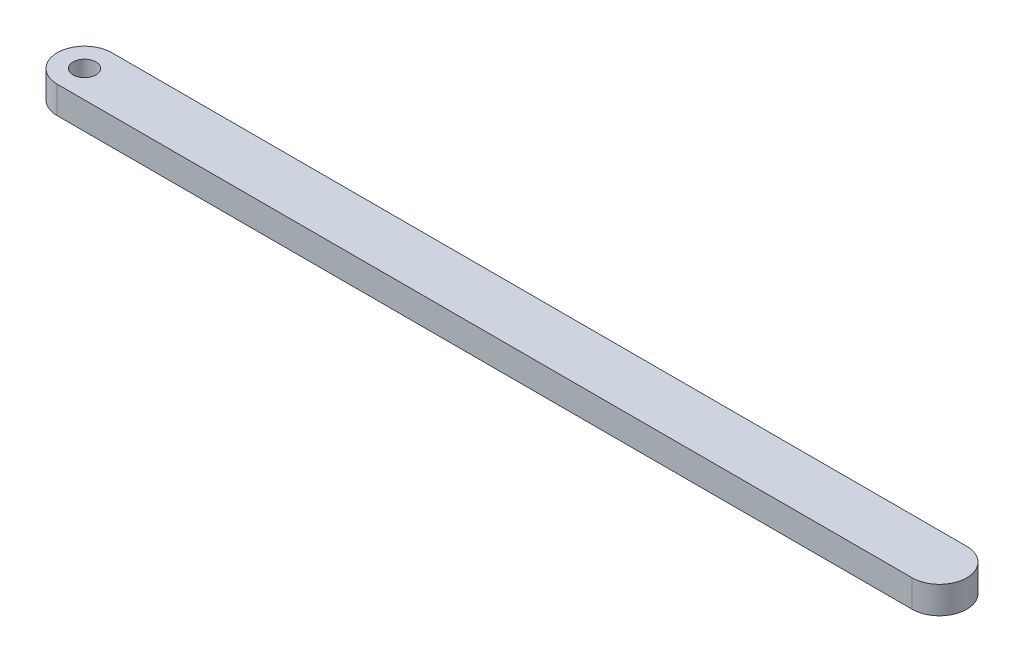
ISO-10303-21;
HEADER;
FILE_DESCRIPTION(('STEP AP214'),'2;1');
FILE_NAME('part.step','',(''),(''),'','','');
FILE_SCHEMA(('AUTOMOTIVE_DESIGN { 1 0 10303 214 1 1 1 1 }'));
ENDSEC;
DATA;
#1=APPLICATION_CONTEXT('core data for automotive mechanical design processes');
#2=APPLICATION_PROTOCOL_DEFINITION('international standard','automotive_design',2000,#1);
#3=PRODUCT_CONTEXT('',#1,'mechanical');
#4=PRODUCT('Part','Part','',(#3));
#5=PRODUCT_RELATED_PRODUCT_CATEGORY('part','',(#4));
#6=PRODUCT_DEFINITION_FORMATION('','',#4);
#7=PRODUCT_DEFINITION_CONTEXT('part definition',#1,'design');
#8=PRODUCT_DEFINITION('design','',#6,#7);
#9=PRODUCT_DEFINITION_SHAPE('','',#8);
#10=(LENGTH_UNIT() NAMED_UNIT(*) SI_UNIT(.MILLI.,.METRE.));
#11=(NAMED_UNIT(*) PLANE_ANGLE_UNIT() SI_UNIT($,.RADIAN.));
#12=(NAMED_UNIT(*) SI_UNIT($,.STERADIAN.) SOLID_ANGLE_UNIT());
#13=UNCERTAINTY_MEASURE_WITH_UNIT(LENGTH_MEASURE(1.E-05),#10,'distance_accuracy_value','');
#14=(GEOMETRIC_REPRESENTATION_CONTEXT(3) GLOBAL_UNCERTAINTY_ASSIGNED_CONTEXT((#13)) GLOBAL_UNIT_ASSIGNED_CONTEXT((#10,
#11,#12)) REPRESENTATION_CONTEXT('',''));
#15=CARTESIAN_POINT('',(0.,0.,0.));
#16=DIRECTION('',(0.,0.,1.));
#17=DIRECTION('',(1.,0.,0.));
#18=AXIS2_PLACEMENT_3D('',#15,#16,#17);
#19=CARTESIAN_POINT('',(0.,6.,0.));
#20=DIRECTION('',(0.,1.,0.));
#21=DIRECTION('',(0.,0.,1.));
#22=AXIS2_PLACEMENT_3D('',#19,#20,#21);
#23=PLANE('',#22);
#24=CARTESIAN_POINT('',(0.,6.,0.));
#25=DIRECTION('',(0.,1.,0.));
#26=DIRECTION('',(0.,0.,1.));
#27=AXIS2_PLACEMENT_3D('',#24,#25,#26);
#28=CIRCLE('',#27,6.);
#29=CARTESIAN_POINT('',(0.,6.,-6.));
#30=VERTEX_POINT('',#29);
#31=CARTESIAN_POINT('',(0.,6.,6.));
#32=VERTEX_POINT('',#31);
#33=EDGE_CURVE('E89',#30,#32,#28,.T.);
#34=ORIENTED_EDGE('',*,*,#33,.T.);
#35=DIRECTION('',(1.,0.,0.));
#36=VECTOR('',#35,1.);
#37=CARTESIAN_POINT('',(0.,6.,6.));
#38=LINE('',#37,#36);
#39=CARTESIAN_POINT('',(188.,6.,6.));
#40=VERTEX_POINT('',#39);
#41=EDGE_CURVE('E84',#32,#40,#38,.T.);
#42=ORIENTED_EDGE('',*,*,#41,.T.);
#43=CARTESIAN_POINT('',(188.,6.,0.));
#44=DIRECTION('',(0.,1.,0.));
#45=DIRECTION('',(0.,0.,1.));
#46=AXIS2_PLACEMENT_3D('',#43,#44,#45);
#47=CIRCLE('',#46,6.);
#48=CARTESIAN_POINT('',(188.,6.,-6.));
#49=VERTEX_POINT('',#48);
#50=EDGE_CURVE('E87',#40,#49,#47,.T.);
#51=ORIENTED_EDGE('',*,*,#50,.T.);
#52=DIRECTION('',(-1.,0.,0.));
#53=VECTOR('',#52,1.);
#54=CARTESIAN_POINT('',(0.,6.,-6.));
#55=LINE('',#54,#53);
#56=EDGE_CURVE('E54',#49,#30,#55,.T.);
#57=ORIENTED_EDGE('',*,*,#56,.T.);
#58=EDGE_LOOP('',(#34,#42,#51,#57));
#59=FACE_BOUND('',#58,.T.);
#60=CARTESIAN_POINT('',(0.,6.,0.));
#61=DIRECTION('',(0.,1.,0.));
#62=DIRECTION('',(0.,0.,1.));
#63=AXIS2_PLACEMENT_3D('',#60,#61,#62);
#64=CIRCLE('',#63,2.5);
#65=CARTESIAN_POINT('',(0.,6.,2.5));
#66=VERTEX_POINT('',#65);
#67=EDGE_CURVE('E104',#66,#66,#64,.T.);
#68=ORIENTED_EDGE('',*,*,#67,.F.);
#69=EDGE_LOOP('',(#68));
#70=FACE_BOUND('',#69,.T.);
#71=ADVANCED_FACE('F37',(#59,#70),#23,.T.);
#72=CARTESIAN_POINT('',(0.,0.,0.));
#73=DIRECTION('',(0.,1.,0.));
#74=DIRECTION('',(0.,0.,1.));
#75=AXIS2_PLACEMENT_3D('',#72,#73,#74);
#76=PLANE('',#75);
#77=CARTESIAN_POINT('',(0.,0.,0.));
#78=DIRECTION('',(0.,1.,0.));
#79=DIRECTION('',(0.,0.,1.));
#80=AXIS2_PLACEMENT_3D('',#77,#78,#79);
#81=CIRCLE('',#80,6.);
#82=CARTESIAN_POINT('',(0.,0.,-6.));
#83=VERTEX_POINT('',#82);
#84=CARTESIAN_POINT('',(0.,0.,6.));
#85=VERTEX_POINT('',#84);
#86=EDGE_CURVE('E101',#83,#85,#81,.T.);
#87=ORIENTED_EDGE('',*,*,#86,.F.);
#88=DIRECTION('',(-1.,0.,0.));
#89=VECTOR('',#88,1.);
#90=CARTESIAN_POINT('',(0.,0.,-6.));
#91=LINE('',#90,#89);
#92=CARTESIAN_POINT('',(188.,0.,-6.));
#93=VERTEX_POINT('',#92);
#94=EDGE_CURVE('E77',#93,#83,#91,.T.);
#95=ORIENTED_EDGE('',*,*,#94,.F.);
#96=CARTESIAN_POINT('',(188.,0.,0.));
#97=DIRECTION('',(0.,1.,0.));
#98=DIRECTION('',(0.,0.,1.));
#99=AXIS2_PLACEMENT_3D('',#96,#97,#98);
#100=CIRCLE('',#99,6.);
#101=CARTESIAN_POINT('',(188.,0.,6.));
#102=VERTEX_POINT('',#101);
#103=EDGE_CURVE('E71',#102,#93,#100,.T.);
#104=ORIENTED_EDGE('',*,*,#103,.F.);
#105=DIRECTION('',(1.,0.,0.));
#106=VECTOR('',#105,1.);
#107=CARTESIAN_POINT('',(0.,0.,6.));
#108=LINE('',#107,#106);
#109=EDGE_CURVE('E93',#85,#102,#108,.T.);
#110=ORIENTED_EDGE('',*,*,#109,.F.);
#111=EDGE_LOOP('',(#87,#95,#104,#110));
#112=FACE_BOUND('',#111,.T.);
#113=CARTESIAN_POINT('',(0.,0.,0.));
#114=DIRECTION('',(0.,1.,0.));
#115=DIRECTION('',(0.,0.,1.));
#116=AXIS2_PLACEMENT_3D('',#113,#114,#115);
#117=CIRCLE('',#116,2.5);
#118=CARTESIAN_POINT('',(0.,0.,2.5));
#119=VERTEX_POINT('',#118);
#120=EDGE_CURVE('E116',#119,#119,#117,.T.);
#121=ORIENTED_EDGE('',*,*,#120,.T.);
#122=EDGE_LOOP('',(#121));
#123=FACE_BOUND('',#122,.T.);
#124=ADVANCED_FACE('F112',(#112,#123),#76,.F.);
#125=CARTESIAN_POINT('',(0.,6.,0.));
#126=DIRECTION('',(0.,-1.,0.));
#127=DIRECTION('',(0.,0.,-1.));
#128=AXIS2_PLACEMENT_3D('',#125,#126,#127);
#129=CYLINDRICAL_SURFACE('',#128,6.);
#130=ORIENTED_EDGE('',*,*,#86,.T.);
#131=DIRECTION('',(0.,-1.,0.));
#132=VECTOR('',#131,1.);
#133=CARTESIAN_POINT('',(0.,6.,6.));
#134=LINE('',#133,#132);
#135=EDGE_CURVE('E11',#32,#85,#134,.T.);
#136=ORIENTED_EDGE('',*,*,#135,.F.);
#137=ORIENTED_EDGE('',*,*,#33,.F.);
#138=DIRECTION('',(0.,-1.,0.));
#139=VECTOR('',#138,1.);
#140=CARTESIAN_POINT('',(0.,6.,-6.));
#141=LINE('',#140,#139);
#142=EDGE_CURVE('E97',#30,#83,#141,.T.);
#143=ORIENTED_EDGE('',*,*,#142,.T.);
#144=EDGE_LOOP('',(#130,#136,#137,#143));
#145=FACE_BOUND('',#144,.T.);
#146=ADVANCED_FACE('F39',(#145),#129,.T.);
#147=CARTESIAN_POINT('',(0.,6.,6.));
#148=DIRECTION('',(0.,0.,-1.));
#149=DIRECTION('',(-1.,0.,0.));
#150=AXIS2_PLACEMENT_3D('',#147,#148,#149);
#151=PLANE('',#150);
#152=ORIENTED_EDGE('',*,*,#109,.T.);
#153=DIRECTION('',(0.,-1.,0.));
#154=VECTOR('',#153,1.);
#155=CARTESIAN_POINT('',(188.,6.,6.));
#156=LINE('',#155,#154);
#157=EDGE_CURVE('E46',#40,#102,#156,.T.);
#158=ORIENTED_EDGE('',*,*,#157,.F.);
#159=ORIENTED_EDGE('',*,*,#41,.F.);
#160=ORIENTED_EDGE('',*,*,#135,.T.);
#161=EDGE_LOOP('',(#152,#158,#159,#160));
#162=FACE_BOUND('',#161,.T.);
#163=ADVANCED_FACE('F92',(#162),#151,.F.);
#164=CARTESIAN_POINT('',(188.,6.,0.));
#165=DIRECTION('',(0.,-1.,0.));
#166=DIRECTION('',(0.,0.,-1.));
#167=AXIS2_PLACEMENT_3D('',#164,#165,#166);
#168=CYLINDRICAL_SURFACE('',#167,6.);
#169=ORIENTED_EDGE('',*,*,#103,.T.);
#170=DIRECTION('',(0.,-1.,0.));
#171=VECTOR('',#170,1.);
#172=CARTESIAN_POINT('',(188.,6.,-6.));
#173=LINE('',#172,#171);
#174=EDGE_CURVE('E94',#49,#93,#173,.T.);
#175=ORIENTED_EDGE('',*,*,#174,.F.);
#176=ORIENTED_EDGE('',*,*,#50,.F.);
#177=ORIENTED_EDGE('',*,*,#157,.T.);
#178=EDGE_LOOP('',(#169,#175,#176,#177));
#179=FACE_BOUND('',#178,.T.);
#180=ADVANCED_FACE('F95',(#179),#168,.T.);
#181=CARTESIAN_POINT('',(0.,6.,-6.));
#182=DIRECTION('',(0.,0.,1.));
#183=DIRECTION('',(1.,0.,0.));
#184=AXIS2_PLACEMENT_3D('',#181,#182,#183);
#185=PLANE('',#184);
#186=ORIENTED_EDGE('',*,*,#94,.T.);
#187=ORIENTED_EDGE('',*,*,#142,.F.);
#188=ORIENTED_EDGE('',*,*,#56,.F.);
#189=ORIENTED_EDGE('',*,*,#174,.T.);
#190=EDGE_LOOP('',(#186,#187,#188,#189));
#191=FACE_BOUND('',#190,.T.);
#192=ADVANCED_FACE('F109',(#191),#185,.F.);
#193=CARTESIAN_POINT('',(0.,6.,0.));
#194=DIRECTION('',(0.,-1.,0.));
#195=DIRECTION('',(0.,0.,-1.));
#196=AXIS2_PLACEMENT_3D('',#193,#194,#195);
#197=CYLINDRICAL_SURFACE('',#196,2.5);
#198=ORIENTED_EDGE('',*,*,#67,.T.);
#199=EDGE_LOOP('',(#198));
#200=FACE_BOUND('',#199,.T.);
#201=ORIENTED_EDGE('',*,*,#120,.F.);
#202=EDGE_LOOP('',(#201));
#203=FACE_BOUND('',#202,.T.);
#204=ADVANCED_FACE('F122',(#200,#203),#197,.F.);
#205=CLOSED_SHELL('',(#71,#124,#146,#163,#180,#192,#204));
#206=MANIFOLD_SOLID_BREP('B2',#205);
#207=ADVANCED_BREP_SHAPE_REPRESENTATION('',(#18,#206),#14);
#208=SHAPE_DEFINITION_REPRESENTATION(#9,#207);
ENDSEC;
END-ISO-10303-21;
